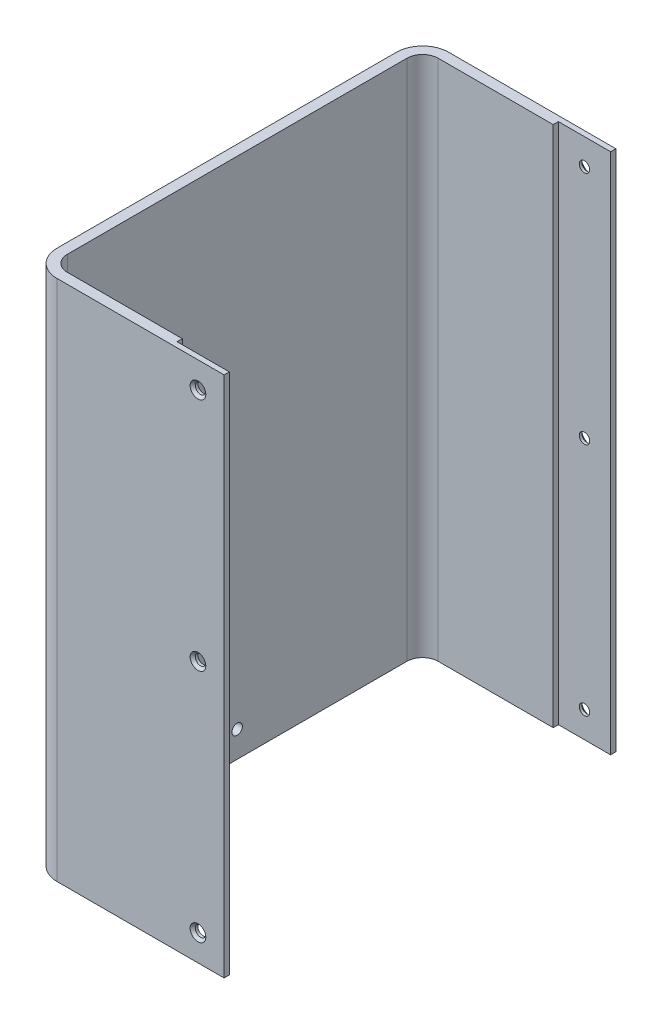
ISO-10303-21;
HEADER;
FILE_DESCRIPTION(('STEP AP214'),'2;1');
FILE_NAME('part.step','',(''),(''),'','','');
FILE_SCHEMA(('AUTOMOTIVE_DESIGN { 1 0 10303 214 1 1 1 1 }'));
ENDSEC;
DATA;
#1=APPLICATION_CONTEXT('core data for automotive mechanical design processes');
#2=APPLICATION_PROTOCOL_DEFINITION('international standard','automotive_design',2000,#1);
#3=PRODUCT_CONTEXT('',#1,'mechanical');
#4=PRODUCT('Part','Part','',(#3));
#5=PRODUCT_RELATED_PRODUCT_CATEGORY('part','',(#4));
#6=PRODUCT_DEFINITION_FORMATION('','',#4);
#7=PRODUCT_DEFINITION_CONTEXT('part definition',#1,'design');
#8=PRODUCT_DEFINITION('design','',#6,#7);
#9=PRODUCT_DEFINITION_SHAPE('','',#8);
#10=(LENGTH_UNIT() NAMED_UNIT(*) SI_UNIT(.MILLI.,.METRE.));
#11=(NAMED_UNIT(*) PLANE_ANGLE_UNIT() SI_UNIT($,.RADIAN.));
#12=(NAMED_UNIT(*) SI_UNIT($,.STERADIAN.) SOLID_ANGLE_UNIT());
#13=UNCERTAINTY_MEASURE_WITH_UNIT(LENGTH_MEASURE(1.E-05),#10,'distance_accuracy_value','');
#14=(GEOMETRIC_REPRESENTATION_CONTEXT(3) GLOBAL_UNCERTAINTY_ASSIGNED_CONTEXT((#13)) GLOBAL_UNIT_ASSIGNED_CONTEXT((#10,
#11,#12)) REPRESENTATION_CONTEXT('',''));
#15=CARTESIAN_POINT('',(0.,0.,0.));
#16=DIRECTION('',(0.,0.,1.));
#17=DIRECTION('',(1.,0.,0.));
#18=AXIS2_PLACEMENT_3D('',#15,#16,#17);
#19=CARTESIAN_POINT('',(0.,10.,35.5));
#20=DIRECTION('',(0.,0.,1.));
#21=DIRECTION('',(1.,0.,0.));
#22=AXIS2_PLACEMENT_3D('',#19,#20,#21);
#23=PLANE('',#22);
#24=DIRECTION('',(0.,1.,0.));
#25=VECTOR('',#24,1.);
#26=CARTESIAN_POINT('',(-32.,10.,35.5));
#27=LINE('',#26,#25);
#28=CARTESIAN_POINT('',(-32.,100.,35.5));
#29=VERTEX_POINT('',#28);
#30=CARTESIAN_POINT('',(-32.,0.,35.5));
#31=VERTEX_POINT('',#30);
#32=EDGE_CURVE('E270',#29,#31,#27,.F.);
#33=ORIENTED_EDGE('',*,*,#32,.F.);
#34=DIRECTION('',(-1.,0.,0.));
#35=VECTOR('',#34,1.);
#36=CARTESIAN_POINT('',(-22.5,100.,35.5));
#37=LINE('',#36,#35);
#38=CARTESIAN_POINT('',(-10.,100.,35.5));
#39=VERTEX_POINT('',#38);
#40=EDGE_CURVE('E305',#39,#29,#37,.T.);
#41=ORIENTED_EDGE('',*,*,#40,.F.);
#42=DIRECTION('',(0.,1.,0.));
#43=VECTOR('',#42,1.);
#44=CARTESIAN_POINT('',(-10.,100.,35.5));
#45=LINE('',#44,#43);
#46=CARTESIAN_POINT('',(-10.,0.,35.5));
#47=VERTEX_POINT('',#46);
#48=EDGE_CURVE('E223',#47,#39,#45,.T.);
#49=ORIENTED_EDGE('',*,*,#48,.F.);
#50=DIRECTION('',(1.,0.,0.));
#51=VECTOR('',#50,1.);
#52=CARTESIAN_POINT('',(0.,0.,35.5));
#53=LINE('',#52,#51);
#54=EDGE_CURVE('E299',#31,#47,#53,.T.);
#55=ORIENTED_EDGE('',*,*,#54,.F.);
#56=EDGE_LOOP('',(#33,#41,#49,#55));
#57=FACE_BOUND('',#56,.T.);
#58=ADVANCED_FACE('F43',(#57),#23,.F.);
#59=CARTESIAN_POINT('',(0.,0.,0.));
#60=DIRECTION('',(1.,0.,0.));
#61=DIRECTION('',(0.,0.,-1.));
#62=AXIS2_PLACEMENT_3D('',#59,#60,#61);
#63=PLANE('',#62);
#64=DIRECTION('',(0.,1.,0.));
#65=VECTOR('',#64,1.);
#66=CARTESIAN_POINT('',(0.,0.,-36.5));
#67=LINE('',#66,#65);
#68=CARTESIAN_POINT('',(0.,0.,-36.5));
#69=VERTEX_POINT('',#68);
#70=CARTESIAN_POINT('',(0.,100.,-36.5));
#71=VERTEX_POINT('',#70);
#72=EDGE_CURVE('E213',#69,#71,#67,.T.);
#73=ORIENTED_EDGE('',*,*,#72,.F.);
#74=DIRECTION('',(0.,0.,1.));
#75=VECTOR('',#74,1.);
#76=CARTESIAN_POINT('',(0.,0.,-37.5));
#77=LINE('',#76,#75);
#78=CARTESIAN_POINT('',(0.,0.,-37.5));
#79=VERTEX_POINT('',#78);
#80=EDGE_CURVE('E282',#79,#69,#77,.T.);
#81=ORIENTED_EDGE('',*,*,#80,.F.);
#82=DIRECTION('',(0.,1.,0.));
#83=VECTOR('',#82,1.);
#84=CARTESIAN_POINT('',(0.,10.,-37.5));
#85=LINE('',#84,#83);
#86=CARTESIAN_POINT('',(0.,100.,-37.5));
#87=VERTEX_POINT('',#86);
#88=EDGE_CURVE('E233',#79,#87,#85,.T.);
#89=ORIENTED_EDGE('',*,*,#88,.T.);
#90=DIRECTION('',(0.,0.,-1.));
#91=VECTOR('',#90,1.);
#92=CARTESIAN_POINT('',(0.,100.,-37.5));
#93=LINE('',#92,#91);
#94=EDGE_CURVE('E285',#71,#87,#93,.T.);
#95=ORIENTED_EDGE('',*,*,#94,.F.);
#96=EDGE_LOOP('',(#73,#81,#89,#95));
#97=FACE_BOUND('',#96,.T.);
#98=ADVANCED_FACE('F364',(#97),#63,.T.);
#99=DIRECTION('',(0.,-1.,0.));
#100=VECTOR('',#99,1.);
#101=CARTESIAN_POINT('',(0.,100.,36.5));
#102=LINE('',#101,#100);
#103=CARTESIAN_POINT('',(0.,100.,36.5));
#104=VERTEX_POINT('',#103);
#105=CARTESIAN_POINT('',(0.,0.,36.5));
#106=VERTEX_POINT('',#105);
#107=EDGE_CURVE('E221',#104,#106,#102,.T.);
#108=ORIENTED_EDGE('',*,*,#107,.F.);
#109=CARTESIAN_POINT('',(0.,100.,37.5));
#110=VERTEX_POINT('',#109);
#111=EDGE_CURVE('E286',#110,#104,#93,.T.);
#112=ORIENTED_EDGE('',*,*,#111,.F.);
#113=DIRECTION('',(0.,1.,0.));
#114=VECTOR('',#113,1.);
#115=CARTESIAN_POINT('',(0.,10.,37.5));
#116=LINE('',#115,#114);
#117=CARTESIAN_POINT('',(0.,0.,37.5));
#118=VERTEX_POINT('',#117);
#119=EDGE_CURVE('E171',#118,#110,#116,.T.);
#120=ORIENTED_EDGE('',*,*,#119,.F.);
#121=EDGE_CURVE('E281',#106,#118,#77,.T.);
#122=ORIENTED_EDGE('',*,*,#121,.F.);
#123=EDGE_LOOP('',(#108,#112,#120,#122));
#124=FACE_BOUND('',#123,.T.);
#125=ADVANCED_FACE('F371',(#124),#63,.T.);
#126=CARTESIAN_POINT('',(-22.5,100.,-37.5));
#127=DIRECTION('',(0.,1.,0.));
#128=DIRECTION('',(-1.,0.,0.));
#129=AXIS2_PLACEMENT_3D('',#126,#127,#128);
#130=PLANE('',#129);
#131=DIRECTION('',(-1.,0.,0.));
#132=VECTOR('',#131,1.);
#133=CARTESIAN_POINT('',(-22.5,100.,-37.5));
#134=LINE('',#133,#132);
#135=CARTESIAN_POINT('',(-32.,100.,-37.5));
#136=VERTEX_POINT('',#135);
#137=EDGE_CURVE('E184',#87,#136,#134,.T.);
#138=ORIENTED_EDGE('',*,*,#137,.T.);
#139=CARTESIAN_POINT('',(-32.,100.,-32.5));
#140=DIRECTION('',(0.,1.,0.));
#141=DIRECTION('',(-1.,0.,0.));
#142=AXIS2_PLACEMENT_3D('',#139,#140,#141);
#143=CIRCLE('',#142,5.);
#144=CARTESIAN_POINT('',(-37.,100.,-32.5));
#145=VERTEX_POINT('',#144);
#146=EDGE_CURVE('E165',#136,#145,#143,.T.);
#147=ORIENTED_EDGE('',*,*,#146,.T.);
#148=DIRECTION('',(0.,0.,1.));
#149=VECTOR('',#148,1.);
#150=CARTESIAN_POINT('',(-37.,100.,-32.5));
#151=LINE('',#150,#149);
#152=CARTESIAN_POINT('',(-37.,100.,32.5));
#153=VERTEX_POINT('',#152);
#154=EDGE_CURVE('E174',#145,#153,#151,.T.);
#155=ORIENTED_EDGE('',*,*,#154,.T.);
#156=CARTESIAN_POINT('',(-32.,100.,32.5));
#157=DIRECTION('',(0.,1.,0.));
#158=DIRECTION('',(-1.,0.,0.));
#159=AXIS2_PLACEMENT_3D('',#156,#157,#158);
#160=CIRCLE('',#159,5.);
#161=CARTESIAN_POINT('',(-32.,100.,37.5));
#162=VERTEX_POINT('',#161);
#163=EDGE_CURVE('E180',#153,#162,#160,.T.);
#164=ORIENTED_EDGE('',*,*,#163,.T.);
#165=DIRECTION('',(-1.,0.,0.));
#166=VECTOR('',#165,1.);
#167=CARTESIAN_POINT('',(-22.5,100.,37.5));
#168=LINE('',#167,#166);
#169=EDGE_CURVE('E279',#110,#162,#168,.T.);
#170=ORIENTED_EDGE('',*,*,#169,.F.);
#171=ORIENTED_EDGE('',*,*,#111,.T.);
#172=DIRECTION('',(1.,0.,0.));
#173=VECTOR('',#172,1.);
#174=CARTESIAN_POINT('',(-10.,100.,36.5));
#175=LINE('',#174,#173);
#176=CARTESIAN_POINT('',(-10.,100.,36.5));
#177=VERTEX_POINT('',#176);
#178=EDGE_CURVE('E231',#177,#104,#175,.T.);
#179=ORIENTED_EDGE('',*,*,#178,.F.);
#180=DIRECTION('',(0.,0.,1.));
#181=VECTOR('',#180,1.);
#182=CARTESIAN_POINT('',(-10.,100.,36.5));
#183=LINE('',#182,#181);
#184=EDGE_CURVE('E225',#39,#177,#183,.T.);
#185=ORIENTED_EDGE('',*,*,#184,.F.);
#186=ORIENTED_EDGE('',*,*,#40,.T.);
#187=CARTESIAN_POINT('',(-32.,100.,32.5));
#188=DIRECTION('',(0.,-1.,0.));
#189=DIRECTION('',(-1.,0.,0.));
#190=AXIS2_PLACEMENT_3D('',#187,#188,#189);
#191=CIRCLE('',#190,3.);
#192=CARTESIAN_POINT('',(-35.,100.,32.5));
#193=VERTEX_POINT('',#192);
#194=EDGE_CURVE('E189',#29,#193,#191,.T.);
#195=ORIENTED_EDGE('',*,*,#194,.T.);
#196=DIRECTION('',(0.,0.,-1.));
#197=VECTOR('',#196,1.);
#198=CARTESIAN_POINT('',(-35.,100.,32.5));
#199=LINE('',#198,#197);
#200=CARTESIAN_POINT('',(-35.,100.,-32.5));
#201=VERTEX_POINT('',#200);
#202=EDGE_CURVE('E192',#193,#201,#199,.T.);
#203=ORIENTED_EDGE('',*,*,#202,.T.);
#204=CARTESIAN_POINT('',(-32.,100.,-32.5));
#205=DIRECTION('',(0.,-1.,0.));
#206=DIRECTION('',(-1.,0.,0.));
#207=AXIS2_PLACEMENT_3D('',#204,#205,#206);
#208=CIRCLE('',#207,3.);
#209=CARTESIAN_POINT('',(-32.,100.,-35.5));
#210=VERTEX_POINT('',#209);
#211=EDGE_CURVE('E195',#201,#210,#208,.T.);
#212=ORIENTED_EDGE('',*,*,#211,.T.);
#213=DIRECTION('',(-1.,0.,0.));
#214=VECTOR('',#213,1.);
#215=CARTESIAN_POINT('',(-22.5,100.,-35.5));
#216=LINE('',#215,#214);
#217=CARTESIAN_POINT('',(-10.,100.,-35.5));
#218=VERTEX_POINT('',#217);
#219=EDGE_CURVE('E48',#210,#218,#216,.F.);
#220=ORIENTED_EDGE('',*,*,#219,.T.);
#221=DIRECTION('',(0.,0.,1.));
#222=VECTOR('',#221,1.);
#223=CARTESIAN_POINT('',(-10.,100.,-35.5));
#224=LINE('',#223,#222);
#225=CARTESIAN_POINT('',(-10.,100.,-36.5));
#226=VERTEX_POINT('',#225);
#227=EDGE_CURVE('E244',#226,#218,#224,.T.);
#228=ORIENTED_EDGE('',*,*,#227,.F.);
#229=DIRECTION('',(1.,0.,0.));
#230=VECTOR('',#229,1.);
#231=CARTESIAN_POINT('',(-10.,100.,-36.5));
#232=LINE('',#231,#230);
#233=EDGE_CURVE('E230',#226,#71,#232,.T.);
#234=ORIENTED_EDGE('',*,*,#233,.T.);
#235=ORIENTED_EDGE('',*,*,#94,.T.);
#236=EDGE_LOOP('',(#138,#147,#155,#164,#170,#171,#179,#185,#186,#195,#203,#212,#220,#228,#234,#235));
#237=FACE_BOUND('',#236,.T.);
#238=ADVANCED_FACE('F182',(#237),#130,.T.);
#239=CARTESIAN_POINT('',(37.,0.,-37.5));
#240=DIRECTION('',(0.,-1.,0.));
#241=DIRECTION('',(1.,0.,0.));
#242=AXIS2_PLACEMENT_3D('',#239,#240,#241);
#243=PLANE('',#242);
#244=DIRECTION('',(1.,0.,0.));
#245=VECTOR('',#244,1.);
#246=CARTESIAN_POINT('',(-10.,0.,36.5));
#247=LINE('',#246,#245);
#248=CARTESIAN_POINT('',(-10.,0.,36.5));
#249=VERTEX_POINT('',#248);
#250=EDGE_CURVE('E228',#249,#106,#247,.T.);
#251=ORIENTED_EDGE('',*,*,#250,.T.);
#252=ORIENTED_EDGE('',*,*,#121,.T.);
#253=DIRECTION('',(1.,0.,0.));
#254=VECTOR('',#253,1.);
#255=CARTESIAN_POINT('',(37.,0.,37.5));
#256=LINE('',#255,#254);
#257=CARTESIAN_POINT('',(-32.,0.,37.5));
#258=VERTEX_POINT('',#257);
#259=EDGE_CURVE('E293',#258,#118,#256,.T.);
#260=ORIENTED_EDGE('',*,*,#259,.F.);
#261=CARTESIAN_POINT('',(-32.,0.,32.5));
#262=DIRECTION('',(0.,-1.,0.));
#263=DIRECTION('',(1.,0.,0.));
#264=AXIS2_PLACEMENT_3D('',#261,#262,#263);
#265=CIRCLE('',#264,5.);
#266=CARTESIAN_POINT('',(-37.,0.,32.5));
#267=VERTEX_POINT('',#266);
#268=EDGE_CURVE('E255',#258,#267,#265,.T.);
#269=ORIENTED_EDGE('',*,*,#268,.T.);
#270=DIRECTION('',(0.,0.,1.));
#271=VECTOR('',#270,1.);
#272=CARTESIAN_POINT('',(-37.,0.,-37.5));
#273=LINE('',#272,#271);
#274=CARTESIAN_POINT('',(-37.,0.,-32.5));
#275=VERTEX_POINT('',#274);
#276=EDGE_CURVE('E259',#275,#267,#273,.T.);
#277=ORIENTED_EDGE('',*,*,#276,.F.);
#278=CARTESIAN_POINT('',(-32.,0.,-32.5));
#279=DIRECTION('',(0.,-1.,0.));
#280=DIRECTION('',(1.,0.,0.));
#281=AXIS2_PLACEMENT_3D('',#278,#279,#280);
#282=CIRCLE('',#281,5.);
#283=CARTESIAN_POINT('',(-32.,0.,-37.5));
#284=VERTEX_POINT('',#283);
#285=EDGE_CURVE('E166',#275,#284,#282,.T.);
#286=ORIENTED_EDGE('',*,*,#285,.T.);
#287=DIRECTION('',(1.,0.,0.));
#288=VECTOR('',#287,1.);
#289=CARTESIAN_POINT('',(37.,0.,-37.5));
#290=LINE('',#289,#288);
#291=EDGE_CURVE('E261',#284,#79,#290,.T.);
#292=ORIENTED_EDGE('',*,*,#291,.T.);
#293=ORIENTED_EDGE('',*,*,#80,.T.);
#294=DIRECTION('',(1.,0.,0.));
#295=VECTOR('',#294,1.);
#296=CARTESIAN_POINT('',(-10.,0.,-36.5));
#297=LINE('',#296,#295);
#298=CARTESIAN_POINT('',(-10.,0.,-36.5));
#299=VERTEX_POINT('',#298);
#300=EDGE_CURVE('E246',#299,#69,#297,.T.);
#301=ORIENTED_EDGE('',*,*,#300,.F.);
#302=DIRECTION('',(0.,0.,-1.));
#303=VECTOR('',#302,1.);
#304=CARTESIAN_POINT('',(-10.,0.,-35.5));
#305=LINE('',#304,#303);
#306=CARTESIAN_POINT('',(-10.,0.,-35.5));
#307=VERTEX_POINT('',#306);
#308=EDGE_CURVE('E238',#307,#299,#305,.T.);
#309=ORIENTED_EDGE('',*,*,#308,.F.);
#310=DIRECTION('',(1.,0.,0.));
#311=VECTOR('',#310,1.);
#312=CARTESIAN_POINT('',(0.,0.,-35.5));
#313=LINE('',#312,#311);
#314=CARTESIAN_POINT('',(-32.,0.,-35.5));
#315=VERTEX_POINT('',#314);
#316=EDGE_CURVE('E269',#315,#307,#313,.T.);
#317=ORIENTED_EDGE('',*,*,#316,.F.);
#318=CARTESIAN_POINT('',(-32.,0.,-32.5));
#319=DIRECTION('',(0.,-1.,0.));
#320=DIRECTION('',(1.,0.,0.));
#321=AXIS2_PLACEMENT_3D('',#318,#319,#320);
#322=CIRCLE('',#321,3.);
#323=CARTESIAN_POINT('',(-35.,0.,-32.5));
#324=VERTEX_POINT('',#323);
#325=EDGE_CURVE('E262',#324,#315,#322,.T.);
#326=ORIENTED_EDGE('',*,*,#325,.F.);
#327=DIRECTION('',(0.,0.,1.));
#328=VECTOR('',#327,1.);
#329=CARTESIAN_POINT('',(-35.,0.,-37.5));
#330=LINE('',#329,#328);
#331=CARTESIAN_POINT('',(-35.,0.,32.5));
#332=VERTEX_POINT('',#331);
#333=EDGE_CURVE('E266',#324,#332,#330,.T.);
#334=ORIENTED_EDGE('',*,*,#333,.T.);
#335=CARTESIAN_POINT('',(-32.,0.,32.5));
#336=DIRECTION('',(0.,-1.,0.));
#337=DIRECTION('',(1.,0.,0.));
#338=AXIS2_PLACEMENT_3D('',#335,#336,#337);
#339=CIRCLE('',#338,3.);
#340=EDGE_CURVE('E264',#31,#332,#339,.T.);
#341=ORIENTED_EDGE('',*,*,#340,.F.);
#342=ORIENTED_EDGE('',*,*,#54,.T.);
#343=DIRECTION('',(0.,0.,-1.));
#344=VECTOR('',#343,1.);
#345=CARTESIAN_POINT('',(-10.,0.,36.5));
#346=LINE('',#345,#344);
#347=EDGE_CURVE('E68',#249,#47,#346,.T.);
#348=ORIENTED_EDGE('',*,*,#347,.F.);
#349=EDGE_LOOP('',(#251,#252,#260,#269,#277,#286,#292,#293,#301,#309,#317,#326,#334,#341,#342,#348));
#350=FACE_BOUND('',#349,.T.);
#351=ADVANCED_FACE('F378',(#350),#243,.T.);
#352=CARTESIAN_POINT('',(0.,10.,-37.5));
#353=DIRECTION('',(0.,0.,1.));
#354=DIRECTION('',(1.,0.,0.));
#355=AXIS2_PLACEMENT_3D('',#352,#353,#354);
#356=PLANE('',#355);
#357=DIRECTION('',(0.,-1.,0.));
#358=VECTOR('',#357,1.);
#359=CARTESIAN_POINT('',(-32.,10.,-37.5));
#360=LINE('',#359,#358);
#361=EDGE_CURVE('E252',#284,#136,#360,.F.);
#362=ORIENTED_EDGE('',*,*,#361,.T.);
#363=ORIENTED_EDGE('',*,*,#137,.F.);
#364=ORIENTED_EDGE('',*,*,#88,.F.);
#365=ORIENTED_EDGE('',*,*,#291,.F.);
#366=EDGE_LOOP('',(#362,#363,#364,#365));
#367=FACE_BOUND('',#366,.T.);
#368=CARTESIAN_POINT('',(-5.,95.,-37.5));
#369=DIRECTION('',(0.,0.,1.));
#370=DIRECTION('',(1.,0.,0.));
#371=AXIS2_PLACEMENT_3D('',#368,#369,#370);
#372=CIRCLE('',#371,1.49999999999999);
#373=CARTESIAN_POINT('',(-3.50000000000001,95.,-37.5));
#374=VERTEX_POINT('',#373);
#375=EDGE_CURVE('E313',#374,#374,#372,.T.);
#376=ORIENTED_EDGE('',*,*,#375,.T.);
#377=EDGE_LOOP('',(#376));
#378=FACE_BOUND('',#377,.T.);
#379=CARTESIAN_POINT('',(-5.,50.,-37.5));
#380=DIRECTION('',(0.,0.,1.));
#381=DIRECTION('',(1.,0.,0.));
#382=AXIS2_PLACEMENT_3D('',#379,#380,#381);
#383=CIRCLE('',#382,1.49999999999999);
#384=CARTESIAN_POINT('',(-3.50000000000001,50.,-37.5));
#385=VERTEX_POINT('',#384);
#386=EDGE_CURVE('E310',#385,#385,#383,.T.);
#387=ORIENTED_EDGE('',*,*,#386,.T.);
#388=EDGE_LOOP('',(#387));
#389=FACE_BOUND('',#388,.T.);
#390=CARTESIAN_POINT('',(-5.,5.,-37.5));
#391=DIRECTION('',(0.,0.,1.));
#392=DIRECTION('',(1.,0.,0.));
#393=AXIS2_PLACEMENT_3D('',#390,#391,#392);
#394=CIRCLE('',#393,1.49999999999999);
#395=CARTESIAN_POINT('',(-3.50000000000001,5.,-37.5));
#396=VERTEX_POINT('',#395);
#397=EDGE_CURVE('E307',#396,#396,#394,.T.);
#398=ORIENTED_EDGE('',*,*,#397,.T.);
#399=EDGE_LOOP('',(#398));
#400=FACE_BOUND('',#399,.T.);
#401=ADVANCED_FACE('F384',(#367,#378,#389,#400),#356,.F.);
#402=CARTESIAN_POINT('',(0.,10.,37.5));
#403=DIRECTION('',(0.,0.,1.));
#404=DIRECTION('',(1.,0.,0.));
#405=AXIS2_PLACEMENT_3D('',#402,#403,#404);
#406=PLANE('',#405);
#407=ORIENTED_EDGE('',*,*,#169,.T.);
#408=DIRECTION('',(0.,-1.,0.));
#409=VECTOR('',#408,1.);
#410=CARTESIAN_POINT('',(-32.,10.,37.5));
#411=LINE('',#410,#409);
#412=EDGE_CURVE('E257',#162,#258,#411,.T.);
#413=ORIENTED_EDGE('',*,*,#412,.T.);
#414=ORIENTED_EDGE('',*,*,#259,.T.);
#415=ORIENTED_EDGE('',*,*,#119,.T.);
#416=EDGE_LOOP('',(#407,#413,#414,#415));
#417=FACE_BOUND('',#416,.T.);
#418=CARTESIAN_POINT('',(-5.,95.,37.5));
#419=DIRECTION('',(0.,0.,1.));
#420=DIRECTION('',(1.,0.,0.));
#421=AXIS2_PLACEMENT_3D('',#418,#419,#420);
#422=CIRCLE('',#421,1.50000000000003);
#423=CARTESIAN_POINT('',(-3.49999999999997,95.,37.5));
#424=VERTEX_POINT('',#423);
#425=EDGE_CURVE('E340',#424,#424,#422,.F.);
#426=ORIENTED_EDGE('',*,*,#425,.T.);
#427=EDGE_LOOP('',(#426));
#428=FACE_BOUND('',#427,.T.);
#429=CARTESIAN_POINT('',(-5.,50.,37.5));
#430=DIRECTION('',(0.,0.,1.));
#431=DIRECTION('',(1.,0.,0.));
#432=AXIS2_PLACEMENT_3D('',#429,#430,#431);
#433=CIRCLE('',#432,1.50000000000003);
#434=CARTESIAN_POINT('',(-3.49999999999997,50.,37.5));
#435=VERTEX_POINT('',#434);
#436=EDGE_CURVE('E337',#435,#435,#433,.F.);
#437=ORIENTED_EDGE('',*,*,#436,.T.);
#438=EDGE_LOOP('',(#437));
#439=FACE_BOUND('',#438,.T.);
#440=CARTESIAN_POINT('',(-5.,5.,37.5));
#441=DIRECTION('',(0.,0.,1.));
#442=DIRECTION('',(1.,0.,0.));
#443=AXIS2_PLACEMENT_3D('',#440,#441,#442);
#444=CIRCLE('',#443,1.50000000000003);
#445=CARTESIAN_POINT('',(-3.49999999999997,5.,37.5));
#446=VERTEX_POINT('',#445);
#447=EDGE_CURVE('E334',#446,#446,#444,.F.);
#448=ORIENTED_EDGE('',*,*,#447,.T.);
#449=EDGE_LOOP('',(#448));
#450=FACE_BOUND('',#449,.T.);
#451=ADVANCED_FACE('F390',(#417,#428,#439,#450),#406,.T.);
#452=CARTESIAN_POINT('',(0.,10.,-35.5));
#453=DIRECTION('',(0.,0.,1.));
#454=DIRECTION('',(1.,0.,0.));
#455=AXIS2_PLACEMENT_3D('',#452,#453,#454);
#456=PLANE('',#455);
#457=ORIENTED_EDGE('',*,*,#219,.F.);
#458=DIRECTION('',(0.,1.,0.));
#459=VECTOR('',#458,1.);
#460=CARTESIAN_POINT('',(-32.,10.,-35.5));
#461=LINE('',#460,#459);
#462=EDGE_CURVE('E265',#315,#210,#461,.T.);
#463=ORIENTED_EDGE('',*,*,#462,.F.);
#464=ORIENTED_EDGE('',*,*,#316,.T.);
#465=DIRECTION('',(0.,-1.,0.));
#466=VECTOR('',#465,1.);
#467=CARTESIAN_POINT('',(-10.,0.,-35.5));
#468=LINE('',#467,#466);
#469=EDGE_CURVE('E236',#218,#307,#468,.T.);
#470=ORIENTED_EDGE('',*,*,#469,.F.);
#471=EDGE_LOOP('',(#457,#463,#464,#470));
#472=FACE_BOUND('',#471,.T.);
#473=ADVANCED_FACE('F393',(#472),#456,.T.);
#474=CARTESIAN_POINT('',(-37.,0.,-37.5));
#475=DIRECTION('',(-1.,0.,0.));
#476=DIRECTION('',(0.,0.,1.));
#477=AXIS2_PLACEMENT_3D('',#474,#475,#476);
#478=PLANE('',#477);
#479=DIRECTION('',(0.,-1.,0.));
#480=VECTOR('',#479,1.);
#481=CARTESIAN_POINT('',(-37.,0.,32.5));
#482=LINE('',#481,#480);
#483=EDGE_CURVE('E170',#267,#153,#482,.F.);
#484=ORIENTED_EDGE('',*,*,#483,.T.);
#485=ORIENTED_EDGE('',*,*,#154,.F.);
#486=DIRECTION('',(0.,-1.,0.));
#487=VECTOR('',#486,1.);
#488=CARTESIAN_POINT('',(-37.,0.,-32.5));
#489=LINE('',#488,#487);
#490=EDGE_CURVE('E160',#145,#275,#489,.T.);
#491=ORIENTED_EDGE('',*,*,#490,.T.);
#492=ORIENTED_EDGE('',*,*,#276,.T.);
#493=EDGE_LOOP('',(#484,#485,#491,#492));
#494=FACE_BOUND('',#493,.T.);
#495=CARTESIAN_POINT('',(-37.,5.,0.));
#496=DIRECTION('',(-1.,0.,0.));
#497=DIRECTION('',(0.,0.,1.));
#498=AXIS2_PLACEMENT_3D('',#495,#496,#497);
#499=CIRCLE('',#498,1.50000000000002);
#500=CARTESIAN_POINT('',(-37.,5.,1.50000000000001));
#501=VERTEX_POINT('',#500);
#502=EDGE_CURVE('E328',#501,#501,#499,.F.);
#503=ORIENTED_EDGE('',*,*,#502,.T.);
#504=EDGE_LOOP('',(#503));
#505=FACE_BOUND('',#504,.T.);
#506=ADVANCED_FACE('F175',(#494,#505),#478,.T.);
#507=CARTESIAN_POINT('',(-32.,0.,-32.5));
#508=DIRECTION('',(0.,1.,0.));
#509=DIRECTION('',(0.,0.,1.));
#510=AXIS2_PLACEMENT_3D('',#507,#508,#509);
#511=CYLINDRICAL_SURFACE('',#510,5.);
#512=ORIENTED_EDGE('',*,*,#490,.F.);
#513=ORIENTED_EDGE('',*,*,#146,.F.);
#514=ORIENTED_EDGE('',*,*,#361,.F.);
#515=ORIENTED_EDGE('',*,*,#285,.F.);
#516=EDGE_LOOP('',(#512,#513,#514,#515));
#517=FACE_BOUND('',#516,.T.);
#518=ADVANCED_FACE('F162',(#517),#511,.T.);
#519=CARTESIAN_POINT('',(-32.,10.,32.5));
#520=DIRECTION('',(0.,-1.,0.));
#521=DIRECTION('',(0.,0.,-1.));
#522=AXIS2_PLACEMENT_3D('',#519,#520,#521);
#523=CYLINDRICAL_SURFACE('',#522,5.);
#524=ORIENTED_EDGE('',*,*,#412,.F.);
#525=ORIENTED_EDGE('',*,*,#163,.F.);
#526=ORIENTED_EDGE('',*,*,#483,.F.);
#527=ORIENTED_EDGE('',*,*,#268,.F.);
#528=EDGE_LOOP('',(#524,#525,#526,#527));
#529=FACE_BOUND('',#528,.T.);
#530=ADVANCED_FACE('F401',(#529),#523,.T.);
#531=CARTESIAN_POINT('',(-35.,0.,-37.5));
#532=DIRECTION('',(-1.,0.,0.));
#533=DIRECTION('',(0.,0.,1.));
#534=AXIS2_PLACEMENT_3D('',#531,#532,#533);
#535=PLANE('',#534);
#536=CARTESIAN_POINT('',(-35.,5.,0.));
#537=DIRECTION('',(-1.,0.,0.));
#538=DIRECTION('',(0.,0.,1.));
#539=AXIS2_PLACEMENT_3D('',#536,#537,#538);
#540=CIRCLE('',#539,1.);
#541=CARTESIAN_POINT('',(-35.,5.,0.999999999999993));
#542=VERTEX_POINT('',#541);
#543=EDGE_CURVE('E197',#542,#542,#540,.F.);
#544=ORIENTED_EDGE('',*,*,#543,.F.);
#545=EDGE_LOOP('',(#544));
#546=FACE_BOUND('',#545,.T.);
#547=DIRECTION('',(0.,1.,0.));
#548=VECTOR('',#547,1.);
#549=CARTESIAN_POINT('',(-35.,0.,-32.5));
#550=LINE('',#549,#548);
#551=EDGE_CURVE('E277',#201,#324,#550,.F.);
#552=ORIENTED_EDGE('',*,*,#551,.F.);
#553=ORIENTED_EDGE('',*,*,#202,.F.);
#554=DIRECTION('',(0.,1.,0.));
#555=VECTOR('',#554,1.);
#556=CARTESIAN_POINT('',(-35.,0.,32.5));
#557=LINE('',#556,#555);
#558=EDGE_CURVE('E275',#332,#193,#557,.T.);
#559=ORIENTED_EDGE('',*,*,#558,.F.);
#560=ORIENTED_EDGE('',*,*,#333,.F.);
#561=EDGE_LOOP('',(#552,#553,#559,#560));
#562=FACE_BOUND('',#561,.T.);
#563=ADVANCED_FACE('F397',(#546,#562),#535,.F.);
#564=CARTESIAN_POINT('',(-32.,0.,-32.5));
#565=DIRECTION('',(0.,1.,0.));
#566=DIRECTION('',(0.,0.,1.));
#567=AXIS2_PLACEMENT_3D('',#564,#565,#566);
#568=CYLINDRICAL_SURFACE('',#567,3.);
#569=ORIENTED_EDGE('',*,*,#462,.T.);
#570=ORIENTED_EDGE('',*,*,#211,.F.);
#571=ORIENTED_EDGE('',*,*,#551,.T.);
#572=ORIENTED_EDGE('',*,*,#325,.T.);
#573=EDGE_LOOP('',(#569,#570,#571,#572));
#574=FACE_BOUND('',#573,.T.);
#575=ADVANCED_FACE('F400',(#574),#568,.F.);
#576=CARTESIAN_POINT('',(-32.,10.,32.5));
#577=DIRECTION('',(0.,-1.,0.));
#578=DIRECTION('',(0.,0.,-1.));
#579=AXIS2_PLACEMENT_3D('',#576,#577,#578);
#580=CYLINDRICAL_SURFACE('',#579,3.);
#581=ORIENTED_EDGE('',*,*,#558,.T.);
#582=ORIENTED_EDGE('',*,*,#194,.F.);
#583=ORIENTED_EDGE('',*,*,#32,.T.);
#584=ORIENTED_EDGE('',*,*,#340,.T.);
#585=EDGE_LOOP('',(#581,#582,#583,#584));
#586=FACE_BOUND('',#585,.T.);
#587=ADVANCED_FACE('F388',(#586),#580,.F.);
#588=CARTESIAN_POINT('',(-10.,100.,36.5));
#589=DIRECTION('',(0.,0.,1.));
#590=DIRECTION('',(1.,0.,0.));
#591=AXIS2_PLACEMENT_3D('',#588,#589,#590);
#592=PLANE('',#591);
#593=CARTESIAN_POINT('',(-5.,5.,36.5));
#594=DIRECTION('',(0.,0.,1.));
#595=DIRECTION('',(1.,0.,0.));
#596=AXIS2_PLACEMENT_3D('',#593,#594,#595);
#597=CIRCLE('',#596,1.);
#598=CARTESIAN_POINT('',(-4.,5.,36.5));
#599=VERTEX_POINT('',#598);
#600=EDGE_CURVE('E210',#599,#599,#597,.F.);
#601=ORIENTED_EDGE('',*,*,#600,.F.);
#602=EDGE_LOOP('',(#601));
#603=FACE_BOUND('',#602,.T.);
#604=CARTESIAN_POINT('',(-5.,50.,36.5));
#605=DIRECTION('',(0.,0.,1.));
#606=DIRECTION('',(1.,0.,0.));
#607=AXIS2_PLACEMENT_3D('',#604,#605,#606);
#608=CIRCLE('',#607,1.);
#609=CARTESIAN_POINT('',(-4.,50.,36.5));
#610=VERTEX_POINT('',#609);
#611=EDGE_CURVE('E214',#610,#610,#608,.F.);
#612=ORIENTED_EDGE('',*,*,#611,.F.);
#613=EDGE_LOOP('',(#612));
#614=FACE_BOUND('',#613,.T.);
#615=CARTESIAN_POINT('',(-5.,95.,36.5));
#616=DIRECTION('',(0.,0.,1.));
#617=DIRECTION('',(1.,0.,0.));
#618=AXIS2_PLACEMENT_3D('',#615,#616,#617);
#619=CIRCLE('',#618,1.);
#620=CARTESIAN_POINT('',(-4.,95.,36.5));
#621=VERTEX_POINT('',#620);
#622=EDGE_CURVE('E204',#621,#621,#619,.F.);
#623=ORIENTED_EDGE('',*,*,#622,.F.);
#624=EDGE_LOOP('',(#623));
#625=FACE_BOUND('',#624,.T.);
#626=ORIENTED_EDGE('',*,*,#107,.T.);
#627=ORIENTED_EDGE('',*,*,#250,.F.);
#628=DIRECTION('',(0.,-1.,0.));
#629=VECTOR('',#628,1.);
#630=CARTESIAN_POINT('',(-10.,100.,36.5));
#631=LINE('',#630,#629);
#632=EDGE_CURVE('E219',#177,#249,#631,.T.);
#633=ORIENTED_EDGE('',*,*,#632,.F.);
#634=ORIENTED_EDGE('',*,*,#178,.T.);
#635=EDGE_LOOP('',(#626,#627,#633,#634));
#636=FACE_BOUND('',#635,.T.);
#637=ADVANCED_FACE('F374',(#603,#614,#625,#636),#592,.F.);
#638=CARTESIAN_POINT('',(-10.,0.,0.));
#639=DIRECTION('',(1.,0.,0.));
#640=DIRECTION('',(0.,0.,-1.));
#641=AXIS2_PLACEMENT_3D('',#638,#639,#640);
#642=PLANE('',#641);
#643=ORIENTED_EDGE('',*,*,#632,.T.);
#644=ORIENTED_EDGE('',*,*,#347,.T.);
#645=ORIENTED_EDGE('',*,*,#48,.T.);
#646=ORIENTED_EDGE('',*,*,#184,.T.);
#647=EDGE_LOOP('',(#643,#644,#645,#646));
#648=FACE_BOUND('',#647,.T.);
#649=ADVANCED_FACE('F420',(#648),#642,.T.);
#650=CARTESIAN_POINT('',(-10.,0.,-36.5));
#651=DIRECTION('',(0.,0.,-1.));
#652=DIRECTION('',(-1.,0.,0.));
#653=AXIS2_PLACEMENT_3D('',#650,#651,#652);
#654=PLANE('',#653);
#655=CARTESIAN_POINT('',(-5.,5.,-36.5));
#656=DIRECTION('',(0.,0.,-1.));
#657=DIRECTION('',(-1.,0.,0.));
#658=AXIS2_PLACEMENT_3D('',#655,#656,#657);
#659=CIRCLE('',#658,1.);
#660=CARTESIAN_POINT('',(-6.,5.,-36.5));
#661=VERTEX_POINT('',#660);
#662=EDGE_CURVE('E201',#661,#661,#659,.T.);
#663=ORIENTED_EDGE('',*,*,#662,.T.);
#664=EDGE_LOOP('',(#663));
#665=FACE_BOUND('',#664,.T.);
#666=CARTESIAN_POINT('',(-5.,50.,-36.5));
#667=DIRECTION('',(0.,0.,-1.));
#668=DIRECTION('',(-1.,0.,0.));
#669=AXIS2_PLACEMENT_3D('',#666,#667,#668);
#670=CIRCLE('',#669,1.);
#671=CARTESIAN_POINT('',(-6.,50.,-36.5));
#672=VERTEX_POINT('',#671);
#673=EDGE_CURVE('E205',#672,#672,#670,.T.);
#674=ORIENTED_EDGE('',*,*,#673,.T.);
#675=EDGE_LOOP('',(#674));
#676=FACE_BOUND('',#675,.T.);
#677=CARTESIAN_POINT('',(-5.,95.,-36.5));
#678=DIRECTION('',(0.,0.,-1.));
#679=DIRECTION('',(-1.,0.,0.));
#680=AXIS2_PLACEMENT_3D('',#677,#678,#679);
#681=CIRCLE('',#680,1.);
#682=CARTESIAN_POINT('',(-6.,95.,-36.5));
#683=VERTEX_POINT('',#682);
#684=EDGE_CURVE('E200',#683,#683,#681,.T.);
#685=ORIENTED_EDGE('',*,*,#684,.T.);
#686=EDGE_LOOP('',(#685));
#687=FACE_BOUND('',#686,.T.);
#688=ORIENTED_EDGE('',*,*,#72,.T.);
#689=ORIENTED_EDGE('',*,*,#233,.F.);
#690=DIRECTION('',(0.,1.,0.));
#691=VECTOR('',#690,1.);
#692=CARTESIAN_POINT('',(-10.,0.,-36.5));
#693=LINE('',#692,#691);
#694=EDGE_CURVE('E241',#299,#226,#693,.T.);
#695=ORIENTED_EDGE('',*,*,#694,.F.);
#696=ORIENTED_EDGE('',*,*,#300,.T.);
#697=EDGE_LOOP('',(#688,#689,#695,#696));
#698=FACE_BOUND('',#697,.T.);
#699=ADVANCED_FACE('F416',(#665,#676,#687,#698),#654,.F.);
#700=CARTESIAN_POINT('',(-10.,0.,0.));
#701=DIRECTION('',(-1.,0.,0.));
#702=DIRECTION('',(0.,0.,1.));
#703=AXIS2_PLACEMENT_3D('',#700,#701,#702);
#704=PLANE('',#703);
#705=ORIENTED_EDGE('',*,*,#469,.T.);
#706=ORIENTED_EDGE('',*,*,#308,.T.);
#707=ORIENTED_EDGE('',*,*,#694,.T.);
#708=ORIENTED_EDGE('',*,*,#227,.T.);
#709=EDGE_LOOP('',(#705,#706,#707,#708));
#710=FACE_BOUND('',#709,.T.);
#711=ADVANCED_FACE('F419',(#710),#704,.F.);
#712=CARTESIAN_POINT('',(-5.,95.,-38.0437587328469));
#713=DIRECTION('',(0.,0.,1.));
#714=DIRECTION('',(1.,0.,0.));
#715=AXIS2_PLACEMENT_3D('',#712,#713,#714);
#716=CYLINDRICAL_SURFACE('',#715,1.);
#717=CARTESIAN_POINT('',(-5.,95.,37.));
#718=DIRECTION('',(0.,0.,1.));
#719=DIRECTION('',(1.,0.,0.));
#720=AXIS2_PLACEMENT_3D('',#717,#718,#719);
#721=CIRCLE('',#720,1.);
#722=CARTESIAN_POINT('',(-4.,95.,37.));
#723=VERTEX_POINT('',#722);
#724=EDGE_CURVE('E331',#723,#723,#721,.T.);
#725=ORIENTED_EDGE('',*,*,#724,.T.);
#726=EDGE_LOOP('',(#725));
#727=FACE_BOUND('',#726,.T.);
#728=ORIENTED_EDGE('',*,*,#622,.T.);
#729=EDGE_LOOP('',(#728));
#730=FACE_BOUND('',#729,.T.);
#731=ADVANCED_FACE('F424',(#727,#730),#716,.F.);
#732=CARTESIAN_POINT('',(-5.,50.,-38.0437587328469));
#733=DIRECTION('',(0.,0.,1.));
#734=DIRECTION('',(1.,0.,0.));
#735=AXIS2_PLACEMENT_3D('',#732,#733,#734);
#736=CYLINDRICAL_SURFACE('',#735,1.);
#737=CARTESIAN_POINT('',(-5.,50.,37.));
#738=DIRECTION('',(0.,0.,1.));
#739=DIRECTION('',(1.,0.,0.));
#740=AXIS2_PLACEMENT_3D('',#737,#738,#739);
#741=CIRCLE('',#740,1.);
#742=CARTESIAN_POINT('',(-4.,50.,37.));
#743=VERTEX_POINT('',#742);
#744=EDGE_CURVE('E54',#743,#743,#741,.T.);
#745=ORIENTED_EDGE('',*,*,#744,.T.);
#746=EDGE_LOOP('',(#745));
#747=FACE_BOUND('',#746,.T.);
#748=ORIENTED_EDGE('',*,*,#611,.T.);
#749=EDGE_LOOP('',(#748));
#750=FACE_BOUND('',#749,.T.);
#751=ADVANCED_FACE('F346',(#747,#750),#736,.F.);
#752=CARTESIAN_POINT('',(-5.,5.,-38.0437587328469));
#753=DIRECTION('',(0.,0.,1.));
#754=DIRECTION('',(1.,0.,0.));
#755=AXIS2_PLACEMENT_3D('',#752,#753,#754);
#756=CYLINDRICAL_SURFACE('',#755,1.);
#757=CARTESIAN_POINT('',(-5.,5.,37.));
#758=DIRECTION('',(0.,0.,1.));
#759=DIRECTION('',(1.,0.,0.));
#760=AXIS2_PLACEMENT_3D('',#757,#758,#759);
#761=CIRCLE('',#760,1.);
#762=CARTESIAN_POINT('',(-4.,5.,37.));
#763=VERTEX_POINT('',#762);
#764=EDGE_CURVE('E11',#763,#763,#761,.T.);
#765=ORIENTED_EDGE('',*,*,#764,.T.);
#766=EDGE_LOOP('',(#765));
#767=FACE_BOUND('',#766,.T.);
#768=ORIENTED_EDGE('',*,*,#600,.T.);
#769=EDGE_LOOP('',(#768));
#770=FACE_BOUND('',#769,.T.);
#771=ADVANCED_FACE('F436',(#767,#770),#756,.F.);
#772=CARTESIAN_POINT('',(-5.,95.,45.5794467087361));
#773=DIRECTION('',(0.,0.,-1.));
#774=DIRECTION('',(-1.,0.,0.));
#775=AXIS2_PLACEMENT_3D('',#772,#773,#774);
#776=CYLINDRICAL_SURFACE('',#775,1.);
#777=CARTESIAN_POINT('',(-5.,95.,-37.));
#778=DIRECTION('',(0.,0.,1.));
#779=DIRECTION('',(1.,0.,0.));
#780=AXIS2_PLACEMENT_3D('',#777,#778,#779);
#781=CIRCLE('',#780,1.);
#782=CARTESIAN_POINT('',(-4.,95.,-37.));
#783=VERTEX_POINT('',#782);
#784=EDGE_CURVE('E316',#783,#783,#781,.F.);
#785=ORIENTED_EDGE('',*,*,#784,.T.);
#786=EDGE_LOOP('',(#785));
#787=FACE_BOUND('',#786,.T.);
#788=ORIENTED_EDGE('',*,*,#684,.F.);
#789=EDGE_LOOP('',(#788));
#790=FACE_BOUND('',#789,.T.);
#791=ADVANCED_FACE('F439',(#787,#790),#776,.F.);
#792=CARTESIAN_POINT('',(-5.,50.,45.5794467087361));
#793=DIRECTION('',(0.,0.,-1.));
#794=DIRECTION('',(-1.,0.,0.));
#795=AXIS2_PLACEMENT_3D('',#792,#793,#794);
#796=CYLINDRICAL_SURFACE('',#795,1.);
#797=CARTESIAN_POINT('',(-5.,50.,-37.));
#798=DIRECTION('',(0.,0.,1.));
#799=DIRECTION('',(1.,0.,0.));
#800=AXIS2_PLACEMENT_3D('',#797,#798,#799);
#801=CIRCLE('',#800,1.);
#802=CARTESIAN_POINT('',(-4.,50.,-37.));
#803=VERTEX_POINT('',#802);
#804=EDGE_CURVE('E319',#803,#803,#801,.F.);
#805=ORIENTED_EDGE('',*,*,#804,.T.);
#806=EDGE_LOOP('',(#805));
#807=FACE_BOUND('',#806,.T.);
#808=ORIENTED_EDGE('',*,*,#673,.F.);
#809=EDGE_LOOP('',(#808));
#810=FACE_BOUND('',#809,.T.);
#811=ADVANCED_FACE('F443',(#807,#810),#796,.F.);
#812=CARTESIAN_POINT('',(-5.,5.,45.5794467087361));
#813=DIRECTION('',(0.,0.,-1.));
#814=DIRECTION('',(-1.,0.,0.));
#815=AXIS2_PLACEMENT_3D('',#812,#813,#814);
#816=CYLINDRICAL_SURFACE('',#815,1.);
#817=CARTESIAN_POINT('',(-5.,5.,-37.));
#818=DIRECTION('',(0.,0.,1.));
#819=DIRECTION('',(1.,0.,0.));
#820=AXIS2_PLACEMENT_3D('',#817,#818,#819);
#821=CIRCLE('',#820,1.);
#822=CARTESIAN_POINT('',(-4.,5.,-37.));
#823=VERTEX_POINT('',#822);
#824=EDGE_CURVE('E322',#823,#823,#821,.F.);
#825=ORIENTED_EDGE('',*,*,#824,.T.);
#826=EDGE_LOOP('',(#825));
#827=FACE_BOUND('',#826,.T.);
#828=ORIENTED_EDGE('',*,*,#662,.F.);
#829=EDGE_LOOP('',(#828));
#830=FACE_BOUND('',#829,.T.);
#831=ADVANCED_FACE('F447',(#827,#830),#816,.F.);
#832=CARTESIAN_POINT('',(0.001000000000001,5.,0.));
#833=DIRECTION('',(-1.,0.,0.));
#834=DIRECTION('',(0.,0.,1.));
#835=AXIS2_PLACEMENT_3D('',#832,#833,#834);
#836=CYLINDRICAL_SURFACE('',#835,1.);
#837=CARTESIAN_POINT('',(-36.5,5.,0.));
#838=DIRECTION('',(-1.,0.,0.));
#839=DIRECTION('',(0.,0.,1.));
#840=AXIS2_PLACEMENT_3D('',#837,#838,#839);
#841=CIRCLE('',#840,1.);
#842=CARTESIAN_POINT('',(-36.5,5.,0.999999999999993));
#843=VERTEX_POINT('',#842);
#844=EDGE_CURVE('E325',#843,#843,#841,.T.);
#845=ORIENTED_EDGE('',*,*,#844,.T.);
#846=EDGE_LOOP('',(#845));
#847=FACE_BOUND('',#846,.T.);
#848=ORIENTED_EDGE('',*,*,#543,.T.);
#849=EDGE_LOOP('',(#848));
#850=FACE_BOUND('',#849,.T.);
#851=ADVANCED_FACE('F451',(#847,#850),#836,.F.);
#852=CARTESIAN_POINT('',(-5.,95.,-37.5));
#853=DIRECTION('',(0.,0.,-1.));
#854=DIRECTION('',(-1.,0.,0.));
#855=AXIS2_PLACEMENT_3D('',#852,#853,#854);
#856=CONICAL_SURFACE('',#855,1.49999999999999,0.785398163397435);
#857=ORIENTED_EDGE('',*,*,#784,.F.);
#858=EDGE_LOOP('',(#857));
#859=FACE_BOUND('',#858,.T.);
#860=ORIENTED_EDGE('',*,*,#375,.F.);
#861=EDGE_LOOP('',(#860));
#862=FACE_BOUND('',#861,.T.);
#863=ADVANCED_FACE('F454',(#859,#862),#856,.F.);
#864=CARTESIAN_POINT('',(-5.,50.,-37.5));
#865=DIRECTION('',(0.,0.,-1.));
#866=DIRECTION('',(-1.,0.,0.));
#867=AXIS2_PLACEMENT_3D('',#864,#865,#866);
#868=CONICAL_SURFACE('',#867,1.49999999999999,0.785398163397435);
#869=ORIENTED_EDGE('',*,*,#804,.F.);
#870=EDGE_LOOP('',(#869));
#871=FACE_BOUND('',#870,.T.);
#872=ORIENTED_EDGE('',*,*,#386,.F.);
#873=EDGE_LOOP('',(#872));
#874=FACE_BOUND('',#873,.T.);
#875=ADVANCED_FACE('F459',(#871,#874),#868,.F.);
#876=CARTESIAN_POINT('',(-5.,5.,-37.5));
#877=DIRECTION('',(0.,0.,-1.));
#878=DIRECTION('',(-1.,0.,0.));
#879=AXIS2_PLACEMENT_3D('',#876,#877,#878);
#880=CONICAL_SURFACE('',#879,1.49999999999999,0.785398163397436);
#881=ORIENTED_EDGE('',*,*,#824,.F.);
#882=EDGE_LOOP('',(#881));
#883=FACE_BOUND('',#882,.T.);
#884=ORIENTED_EDGE('',*,*,#397,.F.);
#885=EDGE_LOOP('',(#884));
#886=FACE_BOUND('',#885,.T.);
#887=ADVANCED_FACE('F521',(#883,#886),#880,.F.);
#888=CARTESIAN_POINT('',(-36.5,5.,0.));
#889=DIRECTION('',(-1.,0.,0.));
#890=DIRECTION('',(0.,0.,1.));
#891=AXIS2_PLACEMENT_3D('',#888,#889,#890);
#892=CONICAL_SURFACE('',#891,1.,0.785398163397449);
#893=ORIENTED_EDGE('',*,*,#502,.F.);
#894=EDGE_LOOP('',(#893));
#895=FACE_BOUND('',#894,.T.);
#896=ORIENTED_EDGE('',*,*,#844,.F.);
#897=EDGE_LOOP('',(#896));
#898=FACE_BOUND('',#897,.T.);
#899=ADVANCED_FACE('F358',(#895,#898),#892,.F.);
#900=CARTESIAN_POINT('',(-5.,95.,37.));
#901=DIRECTION('',(0.,0.,1.));
#902=DIRECTION('',(1.,0.,0.));
#903=AXIS2_PLACEMENT_3D('',#900,#901,#902);
#904=CONICAL_SURFACE('',#903,1.,0.785398163397449);
#905=ORIENTED_EDGE('',*,*,#425,.F.);
#906=EDGE_LOOP('',(#905));
#907=FACE_BOUND('',#906,.T.);
#908=ORIENTED_EDGE('',*,*,#724,.F.);
#909=EDGE_LOOP('',(#908));
#910=FACE_BOUND('',#909,.T.);
#911=ADVANCED_FACE('F351',(#907,#910),#904,.F.);
#912=CARTESIAN_POINT('',(-5.,50.,37.));
#913=DIRECTION('',(0.,0.,1.));
#914=DIRECTION('',(1.,0.,0.));
#915=AXIS2_PLACEMENT_3D('',#912,#913,#914);
#916=CONICAL_SURFACE('',#915,1.,0.785398163397449);
#917=ORIENTED_EDGE('',*,*,#436,.F.);
#918=EDGE_LOOP('',(#917));
#919=FACE_BOUND('',#918,.T.);
#920=ORIENTED_EDGE('',*,*,#744,.F.);
#921=EDGE_LOOP('',(#920));
#922=FACE_BOUND('',#921,.T.);
#923=ADVANCED_FACE('F349',(#919,#922),#916,.F.);
#924=CARTESIAN_POINT('',(-5.,5.,37.));
#925=DIRECTION('',(0.,0.,1.));
#926=DIRECTION('',(1.,0.,0.));
#927=AXIS2_PLACEMENT_3D('',#924,#925,#926);
#928=CONICAL_SURFACE('',#927,1.,0.785398163397449);
#929=ORIENTED_EDGE('',*,*,#447,.F.);
#930=EDGE_LOOP('',(#929));
#931=FACE_BOUND('',#930,.T.);
#932=ORIENTED_EDGE('',*,*,#764,.F.);
#933=EDGE_LOOP('',(#932));
#934=FACE_BOUND('',#933,.T.);
#935=ADVANCED_FACE('F46',(#931,#934),#928,.F.);
#936=CLOSED_SHELL('',(#58,#98,#125,#238,#351,#401,#451,#473,#506,#518,#530,#563,#575,#587,#637,
#649,#699,#711,#731,#751,#771,#791,#811,#831,#851,#863,#875,#887,#899,#911,#923,#935));
#937=MANIFOLD_SOLID_BREP('B2',#936);
#938=ADVANCED_BREP_SHAPE_REPRESENTATION('',(#18,#937),#14);
#939=SHAPE_DEFINITION_REPRESENTATION(#9,#938);
ENDSEC;
END-ISO-10303-21;
